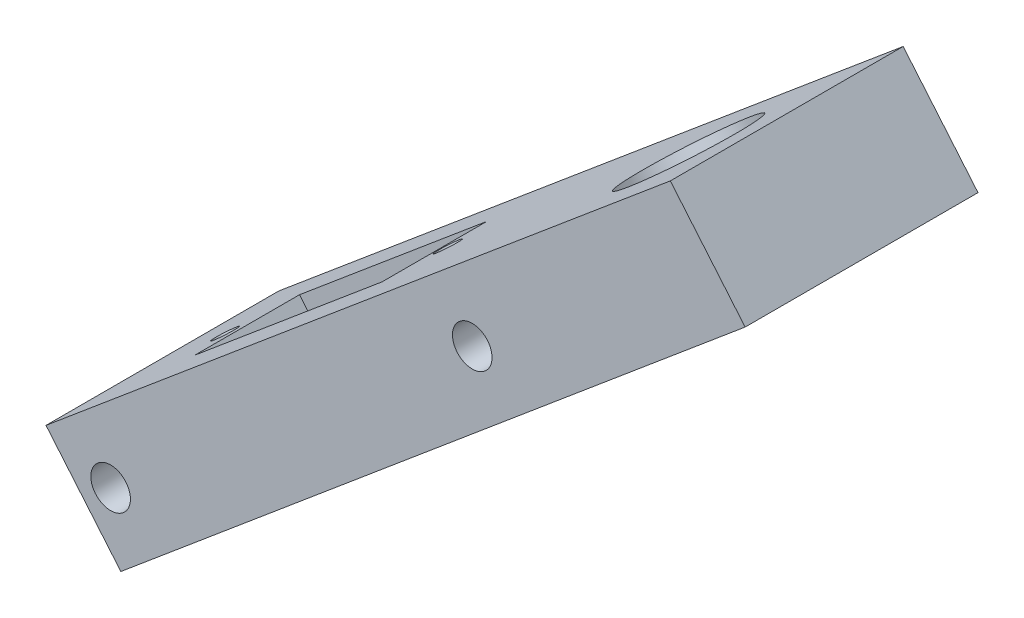
ISO-10303-21;
HEADER;
FILE_DESCRIPTION(('STEP AP214'),'2;1');
FILE_NAME('part.step','',(''),(''),'','','');
FILE_SCHEMA(('AUTOMOTIVE_DESIGN { 1 0 10303 214 1 1 1 1 }'));
ENDSEC;
DATA;
#1=APPLICATION_CONTEXT('core data for automotive mechanical design processes');
#2=APPLICATION_PROTOCOL_DEFINITION('international standard','automotive_design',2000,#1);
#3=PRODUCT_CONTEXT('',#1,'mechanical');
#4=PRODUCT('Part','Part','',(#3));
#5=PRODUCT_RELATED_PRODUCT_CATEGORY('part','',(#4));
#6=PRODUCT_DEFINITION_FORMATION('','',#4);
#7=PRODUCT_DEFINITION_CONTEXT('part definition',#1,'design');
#8=PRODUCT_DEFINITION('design','',#6,#7);
#9=PRODUCT_DEFINITION_SHAPE('','',#8);
#10=(LENGTH_UNIT() NAMED_UNIT(*) SI_UNIT(.MILLI.,.METRE.));
#11=(NAMED_UNIT(*) PLANE_ANGLE_UNIT() SI_UNIT($,.RADIAN.));
#12=(NAMED_UNIT(*) SI_UNIT($,.STERADIAN.) SOLID_ANGLE_UNIT());
#13=UNCERTAINTY_MEASURE_WITH_UNIT(LENGTH_MEASURE(1.E-05),#10,'distance_accuracy_value','');
#14=(GEOMETRIC_REPRESENTATION_CONTEXT(3) GLOBAL_UNCERTAINTY_ASSIGNED_CONTEXT((#13)) GLOBAL_UNIT_ASSIGNED_CONTEXT((#10,
#11,#12)) REPRESENTATION_CONTEXT('',''));
#15=CARTESIAN_POINT('',(0.,0.,0.));
#16=DIRECTION('',(0.,0.,1.));
#17=DIRECTION('',(1.,0.,0.));
#18=AXIS2_PLACEMENT_3D('',#15,#16,#17);
#19=CARTESIAN_POINT('',(-6.4278760968654,7.66044443118977,0.));
#20=DIRECTION('',(-0.64278760968654,0.766044443118977,0.));
#21=DIRECTION('',(-0.766044443118977,-0.64278760968654,0.));
#22=AXIS2_PLACEMENT_3D('',#19,#20,#21);
#23=PLANE('',#22);
#24=CARTESIAN_POINT('',(23.4478571847747,32.7291612089649,0.));
#25=DIRECTION('',(-0.64278760968654,0.766044443118977,0.));
#26=DIRECTION('',(-0.766044443118977,-0.642787609686541,0.));
#27=AXIS2_PLACEMENT_3D('',#24,#25,#26);
#28=CIRCLE('',#27,5.2);
#29=CARTESIAN_POINT('',(19.464426080556,29.3866656385948,0.));
#30=VERTEX_POINT('',#29);
#31=EDGE_CURVE('E226',#30,#30,#28,.T.);
#32=ORIENTED_EDGE('',*,*,#31,.F.);
#33=EDGE_LOOP('',(#32));
#34=FACE_BOUND('',#33,.T.);
#35=CARTESIAN_POINT('',(-16.3864538574121,-0.695794494735249,0.));
#36=DIRECTION('',(-0.64278760968654,0.766044443118977,0.));
#37=DIRECTION('',(-0.766044443118977,-0.642787609686541,0.));
#38=AXIS2_PLACEMENT_3D('',#35,#36,#37);
#39=CIRCLE('',#38,0.999999999999998);
#40=CARTESIAN_POINT('',(-17.1524983005311,-1.33858210442179,0.));
#41=VERTEX_POINT('',#40);
#42=EDGE_CURVE('E232',#41,#41,#39,.T.);
#43=ORIENTED_EDGE('',*,*,#42,.F.);
#44=EDGE_LOOP('',(#43));
#45=FACE_BOUND('',#44,.T.);
#46=CARTESIAN_POINT('',(2.76465722056232,15.3738957474283,0.));
#47=DIRECTION('',(-0.64278760968654,0.766044443118977,0.));
#48=DIRECTION('',(-0.766044443118977,-0.642787609686541,0.));
#49=AXIS2_PLACEMENT_3D('',#46,#47,#48);
#50=CIRCLE('',#49,1.);
#51=CARTESIAN_POINT('',(1.99861277744334,14.7311081377417,0.));
#52=VERTEX_POINT('',#51);
#53=EDGE_CURVE('E238',#52,#52,#50,.T.);
#54=ORIENTED_EDGE('',*,*,#53,.F.);
#55=EDGE_LOOP('',(#54));
#56=FACE_BOUND('',#55,.T.);
#57=DIRECTION('',(0.,0.,1.));
#58=VECTOR('',#57,1.);
#59=CARTESIAN_POINT('',(-21.7487649592449,-5.19530776254104,-10.));
#60=LINE('',#59,#58);
#61=CARTESIAN_POINT('',(-21.7487649592449,-5.19530776254104,-10.));
#62=VERTEX_POINT('',#61);
#63=CARTESIAN_POINT('',(-21.7487649592449,-5.19530776254103,10.));
#64=VERTEX_POINT('',#63);
#65=EDGE_CURVE('E138',#62,#64,#60,.T.);
#66=ORIENTED_EDGE('',*,*,#65,.T.);
#67=DIRECTION('',(0.766044443118977,0.64278760968654,0.));
#68=VECTOR('',#67,1.);
#69=CARTESIAN_POINT('',(-21.7487649592449,-5.19530776254103,10.));
#70=LINE('',#69,#68);
#71=CARTESIAN_POINT('',(31.8743460590835,39.7998249155168,10.));
#72=VERTEX_POINT('',#71);
#73=EDGE_CURVE('E141',#64,#72,#70,.T.);
#74=ORIENTED_EDGE('',*,*,#73,.T.);
#75=DIRECTION('',(0.,0.,-1.));
#76=VECTOR('',#75,1.);
#77=CARTESIAN_POINT('',(31.8743460590835,39.7998249155168,-10.));
#78=LINE('',#77,#76);
#79=CARTESIAN_POINT('',(31.8743460590835,39.7998249155168,-10.));
#80=VERTEX_POINT('',#79);
#81=EDGE_CURVE('E144',#72,#80,#78,.T.);
#82=ORIENTED_EDGE('',*,*,#81,.T.);
#83=DIRECTION('',(-0.766044443118977,-0.64278760968654,0.));
#84=VECTOR('',#83,1.);
#85=CARTESIAN_POINT('',(-21.7487649592449,-5.19530776254104,-10.));
#86=LINE('',#85,#84);
#87=EDGE_CURVE('E146',#80,#62,#86,.T.);
#88=ORIENTED_EDGE('',*,*,#87,.T.);
#89=EDGE_LOOP('',(#66,#74,#82,#88));
#90=FACE_BOUND('',#89,.T.);
#91=DIRECTION('',(0.766044443118977,0.642787609686541,0.));
#92=VECTOR('',#91,1.);
#93=CARTESIAN_POINT('',(1.61559055588379,14.4097143328984,4.49999999999997));
#94=LINE('',#93,#92);
#95=CARTESIAN_POINT('',(-14.4713427496147,0.911174529481098,4.49999999999997));
#96=VERTEX_POINT('',#95);
#97=CARTESIAN_POINT('',(1.61559055588379,14.4097143328984,4.49999999999997));
#98=VERTEX_POINT('',#97);
#99=EDGE_CURVE('E108',#96,#98,#94,.T.);
#100=ORIENTED_EDGE('',*,*,#99,.F.);
#101=DIRECTION('',(0.,0.,1.));
#102=VECTOR('',#101,1.);
#103=CARTESIAN_POINT('',(-14.4713427496147,0.911174529481098,-4.5));
#104=LINE('',#103,#102);
#105=CARTESIAN_POINT('',(-14.4713427496147,0.911174529481098,-4.5));
#106=VERTEX_POINT('',#105);
#107=EDGE_CURVE('E100',#106,#96,#104,.T.);
#108=ORIENTED_EDGE('',*,*,#107,.F.);
#109=DIRECTION('',(-0.766044443118977,-0.642787609686541,0.));
#110=VECTOR('',#109,1.);
#111=CARTESIAN_POINT('',(1.61559055588379,14.4097143328984,-4.5));
#112=LINE('',#111,#110);
#113=CARTESIAN_POINT('',(1.61559055588379,14.4097143328984,-4.5));
#114=VERTEX_POINT('',#113);
#115=EDGE_CURVE('E122',#114,#106,#112,.T.);
#116=ORIENTED_EDGE('',*,*,#115,.F.);
#117=DIRECTION('',(0.,0.,-1.));
#118=VECTOR('',#117,1.);
#119=CARTESIAN_POINT('',(1.61559055588379,14.4097143328984,-4.5));
#120=LINE('',#119,#118);
#121=EDGE_CURVE('E120',#98,#114,#120,.T.);
#122=ORIENTED_EDGE('',*,*,#121,.F.);
#123=EDGE_LOOP('',(#100,#108,#116,#122));
#124=FACE_BOUND('',#123,.T.);
#125=ADVANCED_FACE('F35',(#34,#45,#56,#90,#124),#23,.T.);
#126=CARTESIAN_POINT('',(0.,0.,0.));
#127=DIRECTION('',(-0.64278760968654,0.766044443118977,0.));
#128=DIRECTION('',(-0.766044443118977,-0.64278760968654,0.));
#129=AXIS2_PLACEMENT_3D('',#126,#127,#128);
#130=PLANE('',#129);
#131=CARTESIAN_POINT('',(29.8757332816401,25.0687167777751,0.));
#132=DIRECTION('',(-0.64278760968654,0.766044443118977,0.));
#133=DIRECTION('',(-0.766044443118977,-0.64278760968654,0.));
#134=AXIS2_PLACEMENT_3D('',#131,#132,#133);
#135=CIRCLE('',#134,5.2);
#136=CARTESIAN_POINT('',(25.8923021774214,21.7262212074051,0.));
#137=VERTEX_POINT('',#136);
#138=EDGE_CURVE('E128',#137,#137,#135,.F.);
#139=ORIENTED_EDGE('',*,*,#138,.F.);
#140=EDGE_LOOP('',(#139));
#141=FACE_BOUND('',#140,.T.);
#142=CARTESIAN_POINT('',(-9.9585777605467,-8.35623892592503,0.));
#143=DIRECTION('',(-0.64278760968654,0.766044443118977,0.));
#144=DIRECTION('',(-0.766044443118977,-0.64278760968654,0.));
#145=AXIS2_PLACEMENT_3D('',#142,#143,#144);
#146=CIRCLE('',#145,0.999999999999998);
#147=CARTESIAN_POINT('',(-10.7246222036657,-8.99902653561157,0.));
#148=VERTEX_POINT('',#147);
#149=EDGE_CURVE('E229',#148,#148,#146,.F.);
#150=ORIENTED_EDGE('',*,*,#149,.F.);
#151=EDGE_LOOP('',(#150));
#152=FACE_BOUND('',#151,.T.);
#153=CARTESIAN_POINT('',(9.19253331742773,7.71345131623848,0.));
#154=DIRECTION('',(-0.64278760968654,0.766044443118977,0.));
#155=DIRECTION('',(-0.766044443118977,-0.64278760968654,0.));
#156=AXIS2_PLACEMENT_3D('',#153,#154,#155);
#157=CIRCLE('',#156,1.);
#158=CARTESIAN_POINT('',(8.42648887430875,7.07066370655194,0.));
#159=VERTEX_POINT('',#158);
#160=EDGE_CURVE('E235',#159,#159,#157,.F.);
#161=ORIENTED_EDGE('',*,*,#160,.F.);
#162=EDGE_LOOP('',(#161));
#163=FACE_BOUND('',#162,.T.);
#164=DIRECTION('',(0.,0.,1.));
#165=VECTOR('',#164,1.);
#166=CARTESIAN_POINT('',(-15.3208888623795,-12.8557521937308,-10.));
#167=LINE('',#166,#165);
#168=CARTESIAN_POINT('',(-15.3208888623795,-12.8557521937308,-10.));
#169=VERTEX_POINT('',#168);
#170=CARTESIAN_POINT('',(-15.3208888623795,-12.8557521937308,10.));
#171=VERTEX_POINT('',#170);
#172=EDGE_CURVE('E116',#169,#171,#167,.T.);
#173=ORIENTED_EDGE('',*,*,#172,.F.);
#174=DIRECTION('',(-0.766044443118977,-0.64278760968654,0.));
#175=VECTOR('',#174,1.);
#176=CARTESIAN_POINT('',(-15.3208888623795,-12.8557521937308,-10.));
#177=LINE('',#176,#175);
#178=CARTESIAN_POINT('',(38.3022221559489,32.139380484327,-10.));
#179=VERTEX_POINT('',#178);
#180=EDGE_CURVE('E142',#179,#169,#177,.T.);
#181=ORIENTED_EDGE('',*,*,#180,.F.);
#182=DIRECTION('',(0.,0.,-1.));
#183=VECTOR('',#182,1.);
#184=CARTESIAN_POINT('',(38.3022221559489,32.139380484327,-10.));
#185=LINE('',#184,#183);
#186=CARTESIAN_POINT('',(38.3022221559489,32.139380484327,10.));
#187=VERTEX_POINT('',#186);
#188=EDGE_CURVE('E153',#187,#179,#185,.T.);
#189=ORIENTED_EDGE('',*,*,#188,.F.);
#190=DIRECTION('',(0.766044443118977,0.64278760968654,0.));
#191=VECTOR('',#190,1.);
#192=CARTESIAN_POINT('',(-15.3208888623795,-12.8557521937308,10.));
#193=LINE('',#192,#191);
#194=EDGE_CURVE('E151',#171,#187,#193,.T.);
#195=ORIENTED_EDGE('',*,*,#194,.F.);
#196=EDGE_LOOP('',(#173,#181,#189,#195));
#197=FACE_BOUND('',#196,.T.);
#198=DIRECTION('',(0.,0.,1.));
#199=VECTOR('',#198,1.);
#200=CARTESIAN_POINT('',(-8.04346665274926,-6.74926990170867,-4.5));
#201=LINE('',#200,#199);
#202=CARTESIAN_POINT('',(-8.04346665274926,-6.74926990170867,-4.5));
#203=VERTEX_POINT('',#202);
#204=CARTESIAN_POINT('',(-8.04346665274926,-6.74926990170867,4.49999999999997));
#205=VERTEX_POINT('',#204);
#206=EDGE_CURVE('E58',#203,#205,#201,.T.);
#207=ORIENTED_EDGE('',*,*,#206,.T.);
#208=DIRECTION('',(0.766044443118977,0.642787609686541,0.));
#209=VECTOR('',#208,1.);
#210=CARTESIAN_POINT('',(8.04346665274919,6.74926990170862,4.49999999999997));
#211=LINE('',#210,#209);
#212=CARTESIAN_POINT('',(8.04346665274919,6.74926990170862,4.49999999999997));
#213=VERTEX_POINT('',#212);
#214=EDGE_CURVE('E115',#205,#213,#211,.T.);
#215=ORIENTED_EDGE('',*,*,#214,.T.);
#216=DIRECTION('',(0.,0.,-1.));
#217=VECTOR('',#216,1.);
#218=CARTESIAN_POINT('',(8.04346665274919,6.74926990170862,-4.5));
#219=LINE('',#218,#217);
#220=CARTESIAN_POINT('',(8.04346665274919,6.74926990170862,-4.5));
#221=VERTEX_POINT('',#220);
#222=EDGE_CURVE('E130',#213,#221,#219,.T.);
#223=ORIENTED_EDGE('',*,*,#222,.T.);
#224=DIRECTION('',(-0.766044443118977,-0.642787609686541,0.));
#225=VECTOR('',#224,1.);
#226=CARTESIAN_POINT('',(8.04346665274919,6.74926990170862,-4.5));
#227=LINE('',#226,#225);
#228=EDGE_CURVE('E109',#221,#203,#227,.T.);
#229=ORIENTED_EDGE('',*,*,#228,.T.);
#230=EDGE_LOOP('',(#207,#215,#223,#229));
#231=FACE_BOUND('',#230,.T.);
#232=ADVANCED_FACE('F171',(#141,#152,#163,#197,#231),#130,.F.);
#233=CARTESIAN_POINT('',(-21.7487649592449,-5.19530776254104,-10.));
#234=DIRECTION('',(0.766044443118977,0.642787609686541,0.));
#235=DIRECTION('',(-0.642787609686541,0.766044443118977,0.));
#236=AXIS2_PLACEMENT_3D('',#233,#234,#235);
#237=PLANE('',#236);
#238=ORIENTED_EDGE('',*,*,#172,.T.);
#239=DIRECTION('',(0.642787609686541,-0.766044443118977,0.));
#240=VECTOR('',#239,1.);
#241=CARTESIAN_POINT('',(-21.7487649592449,-5.19530776254103,10.));
#242=LINE('',#241,#240);
#243=EDGE_CURVE('E11',#64,#171,#242,.T.);
#244=ORIENTED_EDGE('',*,*,#243,.F.);
#245=ORIENTED_EDGE('',*,*,#65,.F.);
#246=DIRECTION('',(0.642787609686541,-0.766044443118977,0.));
#247=VECTOR('',#246,1.);
#248=CARTESIAN_POINT('',(-21.7487649592449,-5.19530776254104,-10.));
#249=LINE('',#248,#247);
#250=EDGE_CURVE('E148',#62,#169,#249,.T.);
#251=ORIENTED_EDGE('',*,*,#250,.T.);
#252=EDGE_LOOP('',(#238,#244,#245,#251));
#253=FACE_BOUND('',#252,.T.);
#254=ADVANCED_FACE('F37',(#253),#237,.F.);
#255=CARTESIAN_POINT('',(-21.7487649592449,-5.19530776254103,10.));
#256=DIRECTION('',(0.,0.,-1.));
#257=DIRECTION('',(-1.,0.,0.));
#258=AXIS2_PLACEMENT_3D('',#255,#256,#257);
#259=PLANE('',#258);
#260=CARTESIAN_POINT('',(-16.1982186682855,-7.06488286362593,10.));
#261=DIRECTION('',(0.,0.,1.));
#262=DIRECTION('',(1.,0.,0.));
#263=AXIS2_PLACEMENT_3D('',#260,#261,#262);
#264=CIRCLE('',#263,1.7);
#265=CARTESIAN_POINT('',(-14.4982186682855,-7.06488286362593,10.));
#266=VERTEX_POINT('',#265);
#267=EDGE_CURVE('E217',#266,#266,#264,.T.);
#268=ORIENTED_EDGE('',*,*,#267,.F.);
#269=EDGE_LOOP('',(#268));
#270=FACE_BOUND('',#269,.T.);
#271=CARTESIAN_POINT('',(14.8626492956688,18.9982799889744,10.));
#272=DIRECTION('',(0.,0.,1.));
#273=DIRECTION('',(1.,0.,0.));
#274=AXIS2_PLACEMENT_3D('',#271,#272,#273);
#275=CIRCLE('',#274,1.7);
#276=CARTESIAN_POINT('',(16.5626492956688,18.9982799889744,10.));
#277=VERTEX_POINT('',#276);
#278=EDGE_CURVE('E218',#277,#277,#275,.T.);
#279=ORIENTED_EDGE('',*,*,#278,.F.);
#280=EDGE_LOOP('',(#279));
#281=FACE_BOUND('',#280,.T.);
#282=ORIENTED_EDGE('',*,*,#194,.T.);
#283=DIRECTION('',(0.642787609686541,-0.766044443118977,0.));
#284=VECTOR('',#283,1.);
#285=CARTESIAN_POINT('',(31.8743460590835,39.7998249155168,10.));
#286=LINE('',#285,#284);
#287=EDGE_CURVE('E43',#72,#187,#286,.T.);
#288=ORIENTED_EDGE('',*,*,#287,.F.);
#289=ORIENTED_EDGE('',*,*,#73,.F.);
#290=ORIENTED_EDGE('',*,*,#243,.T.);
#291=EDGE_LOOP('',(#282,#288,#289,#290));
#292=FACE_BOUND('',#291,.T.);
#293=ADVANCED_FACE('F181',(#270,#281,#292),#259,.F.);
#294=CARTESIAN_POINT('',(31.8743460590835,39.7998249155168,-10.));
#295=DIRECTION('',(-0.766044443118977,-0.642787609686541,0.));
#296=DIRECTION('',(0.642787609686541,-0.766044443118977,0.));
#297=AXIS2_PLACEMENT_3D('',#294,#295,#296);
#298=PLANE('',#297);
#299=ORIENTED_EDGE('',*,*,#188,.T.);
#300=DIRECTION('',(0.642787609686541,-0.766044443118977,0.));
#301=VECTOR('',#300,1.);
#302=CARTESIAN_POINT('',(31.8743460590835,39.7998249155168,-10.));
#303=LINE('',#302,#301);
#304=EDGE_CURVE('E158',#80,#179,#303,.T.);
#305=ORIENTED_EDGE('',*,*,#304,.F.);
#306=ORIENTED_EDGE('',*,*,#81,.F.);
#307=ORIENTED_EDGE('',*,*,#287,.T.);
#308=EDGE_LOOP('',(#299,#305,#306,#307));
#309=FACE_BOUND('',#308,.T.);
#310=ADVANCED_FACE('F165',(#309),#298,.F.);
#311=CARTESIAN_POINT('',(-21.7487649592449,-5.19530776254104,-10.));
#312=DIRECTION('',(0.,0.,1.));
#313=DIRECTION('',(1.,0.,0.));
#314=AXIS2_PLACEMENT_3D('',#311,#312,#313);
#315=PLANE('',#314);
#316=CARTESIAN_POINT('',(-16.1982186682855,-7.06488286362593,-10.));
#317=DIRECTION('',(0.,0.,1.));
#318=DIRECTION('',(1.,0.,0.));
#319=AXIS2_PLACEMENT_3D('',#316,#317,#318);
#320=CIRCLE('',#319,1.7);
#321=CARTESIAN_POINT('',(-14.4982186682855,-7.06488286362593,-10.));
#322=VERTEX_POINT('',#321);
#323=EDGE_CURVE('E212',#322,#322,#320,.F.);
#324=ORIENTED_EDGE('',*,*,#323,.F.);
#325=EDGE_LOOP('',(#324));
#326=FACE_BOUND('',#325,.T.);
#327=CARTESIAN_POINT('',(14.8626492956688,18.9982799889744,-10.));
#328=DIRECTION('',(0.,0.,1.));
#329=DIRECTION('',(1.,0.,0.));
#330=AXIS2_PLACEMENT_3D('',#327,#328,#329);
#331=CIRCLE('',#330,1.7);
#332=CARTESIAN_POINT('',(16.5626492956688,18.9982799889744,-10.));
#333=VERTEX_POINT('',#332);
#334=EDGE_CURVE('E215',#333,#333,#331,.F.);
#335=ORIENTED_EDGE('',*,*,#334,.F.);
#336=EDGE_LOOP('',(#335));
#337=FACE_BOUND('',#336,.T.);
#338=ORIENTED_EDGE('',*,*,#180,.T.);
#339=ORIENTED_EDGE('',*,*,#250,.F.);
#340=ORIENTED_EDGE('',*,*,#87,.F.);
#341=ORIENTED_EDGE('',*,*,#304,.T.);
#342=EDGE_LOOP('',(#338,#339,#340,#341));
#343=FACE_BOUND('',#342,.T.);
#344=ADVANCED_FACE('F175',(#326,#337,#343),#315,.F.);
#345=CARTESIAN_POINT('',(-14.4713427496147,0.911174529481098,-4.5));
#346=DIRECTION('',(0.766044443118977,0.642787609686541,0.));
#347=DIRECTION('',(-0.642787609686541,0.766044443118977,0.));
#348=AXIS2_PLACEMENT_3D('',#345,#346,#347);
#349=PLANE('',#348);
#350=ORIENTED_EDGE('',*,*,#206,.F.);
#351=DIRECTION('',(0.642787609686541,-0.766044443118977,0.));
#352=VECTOR('',#351,1.);
#353=CARTESIAN_POINT('',(-14.4713427496147,0.911174529481098,-4.5));
#354=LINE('',#353,#352);
#355=EDGE_CURVE('E104',#106,#203,#354,.T.);
#356=ORIENTED_EDGE('',*,*,#355,.F.);
#357=ORIENTED_EDGE('',*,*,#107,.T.);
#358=DIRECTION('',(0.642787609686541,-0.766044443118977,0.));
#359=VECTOR('',#358,1.);
#360=CARTESIAN_POINT('',(-14.4713427496147,0.911174529481098,4.49999999999997));
#361=LINE('',#360,#359);
#362=EDGE_CURVE('E103',#96,#205,#361,.T.);
#363=ORIENTED_EDGE('',*,*,#362,.T.);
#364=EDGE_LOOP('',(#350,#356,#357,#363));
#365=FACE_BOUND('',#364,.T.);
#366=ADVANCED_FACE('F102',(#365),#349,.T.);
#367=CARTESIAN_POINT('',(1.61559055588379,14.4097143328984,4.49999999999997));
#368=DIRECTION('',(0.,0.,-1.));
#369=DIRECTION('',(-1.,0.,0.));
#370=AXIS2_PLACEMENT_3D('',#367,#368,#369);
#371=PLANE('',#370);
#372=ORIENTED_EDGE('',*,*,#214,.F.);
#373=ORIENTED_EDGE('',*,*,#362,.F.);
#374=ORIENTED_EDGE('',*,*,#99,.T.);
#375=DIRECTION('',(0.642787609686541,-0.766044443118977,0.));
#376=VECTOR('',#375,1.);
#377=CARTESIAN_POINT('',(1.61559055588379,14.4097143328984,4.49999999999997));
#378=LINE('',#377,#376);
#379=EDGE_CURVE('E117',#98,#213,#378,.T.);
#380=ORIENTED_EDGE('',*,*,#379,.T.);
#381=EDGE_LOOP('',(#372,#373,#374,#380));
#382=FACE_BOUND('',#381,.T.);
#383=ADVANCED_FACE('F112',(#382),#371,.T.);
#384=CARTESIAN_POINT('',(1.61559055588379,14.4097143328984,-4.5));
#385=DIRECTION('',(-0.766044443118977,-0.642787609686541,0.));
#386=DIRECTION('',(0.642787609686541,-0.766044443118977,0.));
#387=AXIS2_PLACEMENT_3D('',#384,#385,#386);
#388=PLANE('',#387);
#389=ORIENTED_EDGE('',*,*,#222,.F.);
#390=ORIENTED_EDGE('',*,*,#379,.F.);
#391=ORIENTED_EDGE('',*,*,#121,.T.);
#392=DIRECTION('',(0.642787609686541,-0.766044443118977,0.));
#393=VECTOR('',#392,1.);
#394=CARTESIAN_POINT('',(1.61559055588379,14.4097143328984,-4.5));
#395=LINE('',#394,#393);
#396=EDGE_CURVE('E50',#114,#221,#395,.T.);
#397=ORIENTED_EDGE('',*,*,#396,.T.);
#398=EDGE_LOOP('',(#389,#390,#391,#397));
#399=FACE_BOUND('',#398,.T.);
#400=ADVANCED_FACE('F257',(#399),#388,.T.);
#401=CARTESIAN_POINT('',(1.61559055588379,14.4097143328984,-4.5));
#402=DIRECTION('',(0.,0.,1.));
#403=DIRECTION('',(1.,0.,0.));
#404=AXIS2_PLACEMENT_3D('',#401,#402,#403);
#405=PLANE('',#404);
#406=ORIENTED_EDGE('',*,*,#228,.F.);
#407=ORIENTED_EDGE('',*,*,#396,.F.);
#408=ORIENTED_EDGE('',*,*,#115,.T.);
#409=ORIENTED_EDGE('',*,*,#355,.T.);
#410=EDGE_LOOP('',(#406,#407,#408,#409));
#411=FACE_BOUND('',#410,.T.);
#412=ADVANCED_FACE('F247',(#411),#405,.T.);
#413=CARTESIAN_POINT('',(31.3492166517976,-18.6918556474689,0.));
#414=DIRECTION('',(-0.642787609686541,0.766044443118977,0.));
#415=DIRECTION('',(-0.766044443118977,-0.642787609686541,0.));
#416=AXIS2_PLACEMENT_3D('',#413,#414,#415);
#417=CYLINDRICAL_SURFACE('',#416,1.);
#418=ORIENTED_EDGE('',*,*,#53,.T.);
#419=EDGE_LOOP('',(#418));
#420=FACE_BOUND('',#419,.T.);
#421=ORIENTED_EDGE('',*,*,#160,.T.);
#422=EDGE_LOOP('',(#421));
#423=FACE_BOUND('',#422,.T.);
#424=ADVANCED_FACE('F243',(#420,#423),#417,.F.);
#425=CARTESIAN_POINT('',(12.1981055738231,-34.7615458896325,0.));
#426=DIRECTION('',(-0.642787609686541,0.766044443118977,0.));
#427=DIRECTION('',(-0.766044443118977,-0.642787609686541,0.));
#428=AXIS2_PLACEMENT_3D('',#425,#426,#427);
#429=CYLINDRICAL_SURFACE('',#428,0.999999999999998);
#430=ORIENTED_EDGE('',*,*,#42,.T.);
#431=EDGE_LOOP('',(#430));
#432=FACE_BOUND('',#431,.T.);
#433=ORIENTED_EDGE('',*,*,#149,.T.);
#434=EDGE_LOOP('',(#433));
#435=FACE_BOUND('',#434,.T.);
#436=ADVANCED_FACE('F246',(#432,#435),#429,.F.);
#437=CARTESIAN_POINT('',(52.0324166160099,-1.33659018593235,0.));
#438=DIRECTION('',(-0.642787609686541,0.766044443118977,0.));
#439=DIRECTION('',(-0.766044443118977,-0.642787609686541,0.));
#440=AXIS2_PLACEMENT_3D('',#437,#438,#439);
#441=CYLINDRICAL_SURFACE('',#440,5.2);
#442=ORIENTED_EDGE('',*,*,#31,.T.);
#443=EDGE_LOOP('',(#442));
#444=FACE_BOUND('',#443,.T.);
#445=ORIENTED_EDGE('',*,*,#138,.T.);
#446=EDGE_LOOP('',(#445));
#447=FACE_BOUND('',#446,.T.);
#448=ADVANCED_FACE('F254',(#444,#447),#441,.F.);
#449=CARTESIAN_POINT('',(14.8626492956688,18.9982799889744,-10.001));
#450=DIRECTION('',(0.,0.,1.));
#451=DIRECTION('',(1.,0.,0.));
#452=AXIS2_PLACEMENT_3D('',#449,#450,#451);
#453=CYLINDRICAL_SURFACE('',#452,1.7);
#454=ORIENTED_EDGE('',*,*,#278,.T.);
#455=EDGE_LOOP('',(#454));
#456=FACE_BOUND('',#455,.T.);
#457=ORIENTED_EDGE('',*,*,#334,.T.);
#458=EDGE_LOOP('',(#457));
#459=FACE_BOUND('',#458,.T.);
#460=ADVANCED_FACE('F305',(#456,#459),#453,.F.);
#461=CARTESIAN_POINT('',(-16.1982186682855,-7.06488286362593,-10.001));
#462=DIRECTION('',(0.,0.,1.));
#463=DIRECTION('',(1.,0.,0.));
#464=AXIS2_PLACEMENT_3D('',#461,#462,#463);
#465=CYLINDRICAL_SURFACE('',#464,1.7);
#466=ORIENTED_EDGE('',*,*,#267,.T.);
#467=EDGE_LOOP('',(#466));
#468=FACE_BOUND('',#467,.T.);
#469=ORIENTED_EDGE('',*,*,#323,.T.);
#470=EDGE_LOOP('',(#469));
#471=FACE_BOUND('',#470,.T.);
#472=ADVANCED_FACE('F325',(#468,#471),#465,.F.);
#473=CLOSED_SHELL('',(#125,#232,#254,#293,#310,#344,#366,#383,#400,#412,#424,#436,#448,#460,#472));
#474=MANIFOLD_SOLID_BREP('B2',#473);
#475=ADVANCED_BREP_SHAPE_REPRESENTATION('',(#18,#474),#14);
#476=SHAPE_DEFINITION_REPRESENTATION(#9,#475);
ENDSEC;
END-ISO-10303-21;
